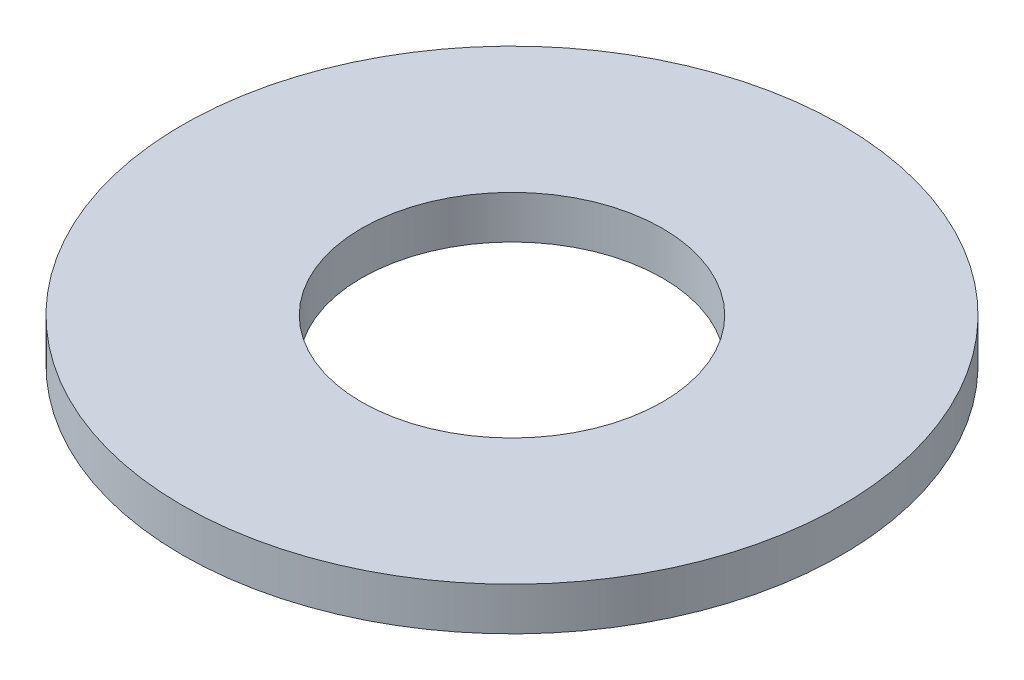
ISO-10303-21;
HEADER;
FILE_DESCRIPTION(('STEP AP214'),'2;1');
FILE_NAME('part.step','',(''),(''),'','','');
FILE_SCHEMA(('AUTOMOTIVE_DESIGN { 1 0 10303 214 1 1 1 1 }'));
ENDSEC;
DATA;
#1=APPLICATION_CONTEXT('core data for automotive mechanical design processes');
#2=APPLICATION_PROTOCOL_DEFINITION('international standard','automotive_design',2000,#1);
#3=PRODUCT_CONTEXT('',#1,'mechanical');
#4=PRODUCT('Part','Part','',(#3));
#5=PRODUCT_RELATED_PRODUCT_CATEGORY('part','',(#4));
#6=PRODUCT_DEFINITION_FORMATION('','',#4);
#7=PRODUCT_DEFINITION_CONTEXT('part definition',#1,'design');
#8=PRODUCT_DEFINITION('design','',#6,#7);
#9=PRODUCT_DEFINITION_SHAPE('','',#8);
#10=(LENGTH_UNIT() NAMED_UNIT(*) SI_UNIT(.MILLI.,.METRE.));
#11=(NAMED_UNIT(*) PLANE_ANGLE_UNIT() SI_UNIT($,.RADIAN.));
#12=(NAMED_UNIT(*) SI_UNIT($,.STERADIAN.) SOLID_ANGLE_UNIT());
#13=UNCERTAINTY_MEASURE_WITH_UNIT(LENGTH_MEASURE(1.E-05),#10,'distance_accuracy_value','');
#14=(GEOMETRIC_REPRESENTATION_CONTEXT(3) GLOBAL_UNCERTAINTY_ASSIGNED_CONTEXT((#13)) GLOBAL_UNIT_ASSIGNED_CONTEXT((#10,
#11,#12)) REPRESENTATION_CONTEXT('',''));
#15=CARTESIAN_POINT('',(0.,0.,0.));
#16=DIRECTION('',(0.,0.,1.));
#17=DIRECTION('',(1.,0.,0.));
#18=AXIS2_PLACEMENT_3D('',#15,#16,#17);
#19=CARTESIAN_POINT('',(0.,3.81,0.));
#20=DIRECTION('',(0.,1.,0.));
#21=DIRECTION('',(0.,0.,1.));
#22=AXIS2_PLACEMENT_3D('',#19,#20,#21);
#23=PLANE('',#22);
#24=CARTESIAN_POINT('',(0.,3.81,0.));
#25=DIRECTION('',(0.,1.,0.));
#26=DIRECTION('',(0.,0.,1.));
#27=AXIS2_PLACEMENT_3D('',#24,#25,#26);
#28=CIRCLE('',#27,29.21);
#29=CARTESIAN_POINT('',(0.,3.81,-29.21));
#30=VERTEX_POINT('',#29);
#31=EDGE_CURVE('E10',#30,#30,#28,.T.);
#32=ORIENTED_EDGE('',*,*,#31,.T.);
#33=EDGE_LOOP('',(#32));
#34=FACE_BOUND('',#33,.T.);
#35=CARTESIAN_POINT('',(0.,3.81,0.));
#36=DIRECTION('',(0.,1.,0.));
#37=DIRECTION('',(0.,0.,1.));
#38=AXIS2_PLACEMENT_3D('',#35,#36,#37);
#39=CIRCLE('',#38,13.335);
#40=CARTESIAN_POINT('',(0.,3.81,-13.335));
#41=VERTEX_POINT('',#40);
#42=EDGE_CURVE('E56',#41,#41,#39,.T.);
#43=ORIENTED_EDGE('',*,*,#42,.F.);
#44=EDGE_LOOP('',(#43));
#45=FACE_BOUND('',#44,.T.);
#46=ADVANCED_FACE('F43',(#34,#45),#23,.T.);
#47=CARTESIAN_POINT('',(0.,0.,0.));
#48=DIRECTION('',(0.,1.,0.));
#49=DIRECTION('',(0.,0.,1.));
#50=AXIS2_PLACEMENT_3D('',#47,#48,#49);
#51=PLANE('',#50);
#52=CARTESIAN_POINT('',(0.,0.,0.));
#53=DIRECTION('',(0.,1.,0.));
#54=DIRECTION('',(0.,0.,1.));
#55=AXIS2_PLACEMENT_3D('',#52,#53,#54);
#56=CIRCLE('',#55,29.21);
#57=CARTESIAN_POINT('',(0.,0.,-29.21));
#58=VERTEX_POINT('',#57);
#59=EDGE_CURVE('E47',#58,#58,#56,.T.);
#60=ORIENTED_EDGE('',*,*,#59,.F.);
#61=EDGE_LOOP('',(#60));
#62=FACE_BOUND('',#61,.T.);
#63=CARTESIAN_POINT('',(0.,0.,0.));
#64=DIRECTION('',(0.,1.,0.));
#65=DIRECTION('',(0.,0.,1.));
#66=AXIS2_PLACEMENT_3D('',#63,#64,#65);
#67=CIRCLE('',#66,13.335);
#68=CARTESIAN_POINT('',(0.,0.,-13.335));
#69=VERTEX_POINT('',#68);
#70=EDGE_CURVE('E58',#69,#69,#67,.T.);
#71=ORIENTED_EDGE('',*,*,#70,.T.);
#72=EDGE_LOOP('',(#71));
#73=FACE_BOUND('',#72,.T.);
#74=ADVANCED_FACE('F70',(#62,#73),#51,.F.);
#75=CARTESIAN_POINT('',(0.,3.81,0.));
#76=DIRECTION('',(0.,-1.,0.));
#77=DIRECTION('',(0.,0.,-1.));
#78=AXIS2_PLACEMENT_3D('',#75,#76,#77);
#79=CYLINDRICAL_SURFACE('',#78,29.21);
#80=CARTESIAN_POINT('',(0.,3.81,-29.21));
#81=CARTESIAN_POINT('',(0.,3.7703125,-29.21));
#82=CARTESIAN_POINT('',(0.,3.730625,-29.21));
#83=CARTESIAN_POINT('',(0.,3.65125,-29.21));
#84=CARTESIAN_POINT('',(0.,3.6115625,-29.21));
#85=CARTESIAN_POINT('',(0.,3.5321875,-29.21));
#86=CARTESIAN_POINT('',(0.,3.4925,-29.21));
#87=CARTESIAN_POINT('',(0.,3.413125,-29.21));
#88=CARTESIAN_POINT('',(0.,3.3734375,-29.21));
#89=CARTESIAN_POINT('',(0.,3.2940625,-29.21));
#90=CARTESIAN_POINT('',(0.,3.254375,-29.21));
#91=CARTESIAN_POINT('',(0.,3.175,-29.21));
#92=CARTESIAN_POINT('',(0.,3.1353125,-29.21));
#93=CARTESIAN_POINT('',(0.,3.0559375,-29.21));
#94=CARTESIAN_POINT('',(0.,3.01625,-29.21));
#95=CARTESIAN_POINT('',(0.,2.936875,-29.21));
#96=CARTESIAN_POINT('',(0.,2.8971875,-29.21));
#97=CARTESIAN_POINT('',(0.,2.8178125,-29.21));
#98=CARTESIAN_POINT('',(0.,2.778125,-29.21));
#99=CARTESIAN_POINT('',(0.,2.69875,-29.21));
#100=CARTESIAN_POINT('',(0.,2.6590625,-29.21));
#101=CARTESIAN_POINT('',(0.,2.5796875,-29.21));
#102=CARTESIAN_POINT('',(0.,2.54,-29.21));
#103=CARTESIAN_POINT('',(0.,2.460625,-29.21));
#104=CARTESIAN_POINT('',(0.,2.4209375,-29.21));
#105=CARTESIAN_POINT('',(0.,2.3415625,-29.21));
#106=CARTESIAN_POINT('',(0.,2.301875,-29.21));
#107=CARTESIAN_POINT('',(0.,2.2225,-29.21));
#108=CARTESIAN_POINT('',(0.,2.1828125,-29.21));
#109=CARTESIAN_POINT('',(0.,2.1034375,-29.21));
#110=CARTESIAN_POINT('',(0.,2.06375,-29.21));
#111=CARTESIAN_POINT('',(0.,1.984375,-29.21));
#112=CARTESIAN_POINT('',(0.,1.9446875,-29.21));
#113=CARTESIAN_POINT('',(0.,1.8653125,-29.21));
#114=CARTESIAN_POINT('',(0.,1.825625,-29.21));
#115=CARTESIAN_POINT('',(0.,1.74625,-29.21));
#116=CARTESIAN_POINT('',(0.,1.7065625,-29.21));
#117=CARTESIAN_POINT('',(0.,1.6271875,-29.21));
#118=CARTESIAN_POINT('',(0.,1.5875,-29.21));
#119=CARTESIAN_POINT('',(0.,1.508125,-29.21));
#120=CARTESIAN_POINT('',(0.,1.4684375,-29.21));
#121=CARTESIAN_POINT('',(0.,1.3890625,-29.21));
#122=CARTESIAN_POINT('',(0.,1.349375,-29.21));
#123=CARTESIAN_POINT('',(0.,1.27,-29.21));
#124=CARTESIAN_POINT('',(0.,1.2303125,-29.21));
#125=CARTESIAN_POINT('',(0.,1.1509375,-29.21));
#126=CARTESIAN_POINT('',(0.,1.11125,-29.21));
#127=CARTESIAN_POINT('',(0.,1.031875,-29.21));
#128=CARTESIAN_POINT('',(0.,0.9921875,-29.21));
#129=CARTESIAN_POINT('',(0.,0.9128125,-29.21));
#130=CARTESIAN_POINT('',(0.,0.873125,-29.21));
#131=CARTESIAN_POINT('',(0.,0.79375,-29.21));
#132=CARTESIAN_POINT('',(0.,0.7540625,-29.21));
#133=CARTESIAN_POINT('',(0.,0.6746875,-29.21));
#134=CARTESIAN_POINT('',(0.,0.635,-29.21));
#135=CARTESIAN_POINT('',(0.,0.555625,-29.21));
#136=CARTESIAN_POINT('',(0.,0.5159375,-29.21));
#137=CARTESIAN_POINT('',(0.,0.4365625,-29.21));
#138=CARTESIAN_POINT('',(0.,0.396875,-29.21));
#139=CARTESIAN_POINT('',(0.,0.3175,-29.21));
#140=CARTESIAN_POINT('',(0.,0.2778125,-29.21));
#141=CARTESIAN_POINT('',(0.,0.1984375,-29.21));
#142=CARTESIAN_POINT('',(0.,0.15875,-29.21));
#143=CARTESIAN_POINT('',(0.,0.0793749999999999,-29.21));
#144=CARTESIAN_POINT('',(0.,0.0396874999999999,-29.21));
#145=CARTESIAN_POINT('',(0.,0.,-29.21));
#146=B_SPLINE_CURVE_WITH_KNOTS('',3,(#80,#81,#82,#83,#84,#85,#86,#87,#88,#89,#90,#91,#92,#93,
#94,#95,#96,#97,#98,#99,#100,#101,#102,#103,#104,#105,#106,#107,#108,#109,#110,#111,#112,#113,
#114,#115,#116,#117,#118,#119,#120,#121,#122,#123,#124,#125,#126,#127,#128,#129,#130,#131,#132,
#133,#134,#135,#136,#137,#138,#139,#140,#141,#142,#143,#144,#145),.UNSPECIFIED.,.F.,.F.,(4,2,2,
2,2,2,2,2,2,2,2,2,2,2,2,2,2,2,2,2,2,2,2,2,2,2,2,2,2,2,2,2,4),(0.,0.1190625,0.238125,0.3571875,
0.47625,0.5953125,0.714375,0.8334375,0.9525,1.0715625,1.190625,1.3096875,1.42875,1.5478125,
1.666875,1.7859375,1.905,2.0240625,2.143125,2.2621875,2.38125,2.5003125,2.619375,2.7384375,
2.8575,2.9765625,3.095625,3.2146875,3.33375,3.4528125,3.571875,3.6909375,3.81),.UNSPECIFIED.);
#147=EDGE_CURVE('BSEAM45',#30,#58,#146,.T.);
#148=ORIENTED_EDGE('',*,*,#31,.F.);
#149=ORIENTED_EDGE('',*,*,#59,.T.);
#150=ORIENTED_EDGE('',*,*,#147,.T.);
#151=ORIENTED_EDGE('',*,*,#147,.F.);
#152=EDGE_LOOP('',(#148,#150,#149,#151));
#153=FACE_BOUND('',#152,.T.);
#154=ADVANCED_FACE('F45',(#153),#79,.T.);
#155=CARTESIAN_POINT('',(0.,3.81,0.));
#156=DIRECTION('',(0.,-1.,0.));
#157=DIRECTION('',(0.,0.,-1.));
#158=AXIS2_PLACEMENT_3D('',#155,#156,#157);
#159=CYLINDRICAL_SURFACE('',#158,13.335);
#160=CARTESIAN_POINT('',(0.,3.81,-13.335));
#161=CARTESIAN_POINT('',(0.,3.7703125,-13.335));
#162=CARTESIAN_POINT('',(0.,3.730625,-13.335));
#163=CARTESIAN_POINT('',(0.,3.65125,-13.335));
#164=CARTESIAN_POINT('',(0.,3.6115625,-13.335));
#165=CARTESIAN_POINT('',(0.,3.5321875,-13.335));
#166=CARTESIAN_POINT('',(0.,3.4925,-13.335));
#167=CARTESIAN_POINT('',(0.,3.413125,-13.335));
#168=CARTESIAN_POINT('',(0.,3.3734375,-13.335));
#169=CARTESIAN_POINT('',(0.,3.2940625,-13.335));
#170=CARTESIAN_POINT('',(0.,3.254375,-13.335));
#171=CARTESIAN_POINT('',(0.,3.175,-13.335));
#172=CARTESIAN_POINT('',(0.,3.1353125,-13.335));
#173=CARTESIAN_POINT('',(0.,3.0559375,-13.335));
#174=CARTESIAN_POINT('',(0.,3.01625,-13.335));
#175=CARTESIAN_POINT('',(0.,2.936875,-13.335));
#176=CARTESIAN_POINT('',(0.,2.8971875,-13.335));
#177=CARTESIAN_POINT('',(0.,2.8178125,-13.335));
#178=CARTESIAN_POINT('',(0.,2.778125,-13.335));
#179=CARTESIAN_POINT('',(0.,2.69875,-13.335));
#180=CARTESIAN_POINT('',(0.,2.6590625,-13.335));
#181=CARTESIAN_POINT('',(0.,2.5796875,-13.335));
#182=CARTESIAN_POINT('',(0.,2.54,-13.335));
#183=CARTESIAN_POINT('',(0.,2.460625,-13.335));
#184=CARTESIAN_POINT('',(0.,2.4209375,-13.335));
#185=CARTESIAN_POINT('',(0.,2.3415625,-13.335));
#186=CARTESIAN_POINT('',(0.,2.301875,-13.335));
#187=CARTESIAN_POINT('',(0.,2.2225,-13.335));
#188=CARTESIAN_POINT('',(0.,2.1828125,-13.335));
#189=CARTESIAN_POINT('',(0.,2.1034375,-13.335));
#190=CARTESIAN_POINT('',(0.,2.06375,-13.335));
#191=CARTESIAN_POINT('',(0.,1.984375,-13.335));
#192=CARTESIAN_POINT('',(0.,1.9446875,-13.335));
#193=CARTESIAN_POINT('',(0.,1.8653125,-13.335));
#194=CARTESIAN_POINT('',(0.,1.825625,-13.335));
#195=CARTESIAN_POINT('',(0.,1.74625,-13.335));
#196=CARTESIAN_POINT('',(0.,1.7065625,-13.335));
#197=CARTESIAN_POINT('',(0.,1.6271875,-13.335));
#198=CARTESIAN_POINT('',(0.,1.5875,-13.335));
#199=CARTESIAN_POINT('',(0.,1.508125,-13.335));
#200=CARTESIAN_POINT('',(0.,1.4684375,-13.335));
#201=CARTESIAN_POINT('',(0.,1.3890625,-13.335));
#202=CARTESIAN_POINT('',(0.,1.349375,-13.335));
#203=CARTESIAN_POINT('',(0.,1.27,-13.335));
#204=CARTESIAN_POINT('',(0.,1.2303125,-13.335));
#205=CARTESIAN_POINT('',(0.,1.1509375,-13.335));
#206=CARTESIAN_POINT('',(0.,1.11125,-13.335));
#207=CARTESIAN_POINT('',(0.,1.031875,-13.335));
#208=CARTESIAN_POINT('',(0.,0.9921875,-13.335));
#209=CARTESIAN_POINT('',(0.,0.9128125,-13.335));
#210=CARTESIAN_POINT('',(0.,0.873125,-13.335));
#211=CARTESIAN_POINT('',(0.,0.79375,-13.335));
#212=CARTESIAN_POINT('',(0.,0.7540625,-13.335));
#213=CARTESIAN_POINT('',(0.,0.6746875,-13.335));
#214=CARTESIAN_POINT('',(0.,0.635,-13.335));
#215=CARTESIAN_POINT('',(0.,0.555625,-13.335));
#216=CARTESIAN_POINT('',(0.,0.5159375,-13.335));
#217=CARTESIAN_POINT('',(0.,0.4365625,-13.335));
#218=CARTESIAN_POINT('',(0.,0.396875,-13.335));
#219=CARTESIAN_POINT('',(0.,0.3175,-13.335));
#220=CARTESIAN_POINT('',(0.,0.2778125,-13.335));
#221=CARTESIAN_POINT('',(0.,0.1984375,-13.335));
#222=CARTESIAN_POINT('',(0.,0.15875,-13.335));
#223=CARTESIAN_POINT('',(0.,0.0793749999999999,-13.335));
#224=CARTESIAN_POINT('',(0.,0.0396874999999999,-13.335));
#225=CARTESIAN_POINT('',(0.,0.,-13.335));
#226=B_SPLINE_CURVE_WITH_KNOTS('',3,(#160,#161,#162,#163,#164,#165,#166,#167,#168,#169,#170,
#171,#172,#173,#174,#175,#176,#177,#178,#179,#180,#181,#182,#183,#184,#185,#186,#187,#188,#189,
#190,#191,#192,#193,#194,#195,#196,#197,#198,#199,#200,#201,#202,#203,#204,#205,#206,#207,#208,
#209,#210,#211,#212,#213,#214,#215,#216,#217,#218,#219,#220,#221,#222,#223,#224,#225),
.UNSPECIFIED.,.F.,.F.,(4,2,2,2,2,2,2,2,2,2,2,2,2,2,2,2,2,2,2,2,2,2,2,2,2,2,2,2,2,2,2,2,4),(0.,
0.1190625,0.238125,0.3571875,0.47625,0.5953125,0.714375,0.8334375,0.9525,1.0715625,1.190625,
1.3096875,1.42875,1.5478125,1.666875,1.7859375,1.905,2.0240625,2.143125,2.2621875,2.38125,
2.5003125,2.619375,2.7384375,2.8575,2.9765625,3.095625,3.2146875,3.33375,3.4528125,3.571875,
3.6909375,3.81),.UNSPECIFIED.);
#227=EDGE_CURVE('BSEAM66',#41,#69,#226,.T.);
#228=ORIENTED_EDGE('',*,*,#42,.T.);
#229=ORIENTED_EDGE('',*,*,#70,.F.);
#230=ORIENTED_EDGE('',*,*,#227,.T.);
#231=ORIENTED_EDGE('',*,*,#227,.F.);
#232=EDGE_LOOP('',(#228,#230,#229,#231));
#233=FACE_BOUND('',#232,.T.);
#234=ADVANCED_FACE('F66',(#233),#159,.F.);
#235=CLOSED_SHELL('',(#46,#74,#154,#234));
#236=MANIFOLD_SOLID_BREP('B2',#235);
#237=ADVANCED_BREP_SHAPE_REPRESENTATION('',(#18,#236),#14);
#238=SHAPE_DEFINITION_REPRESENTATION(#9,#237);
ENDSEC;
END-ISO-10303-21;
